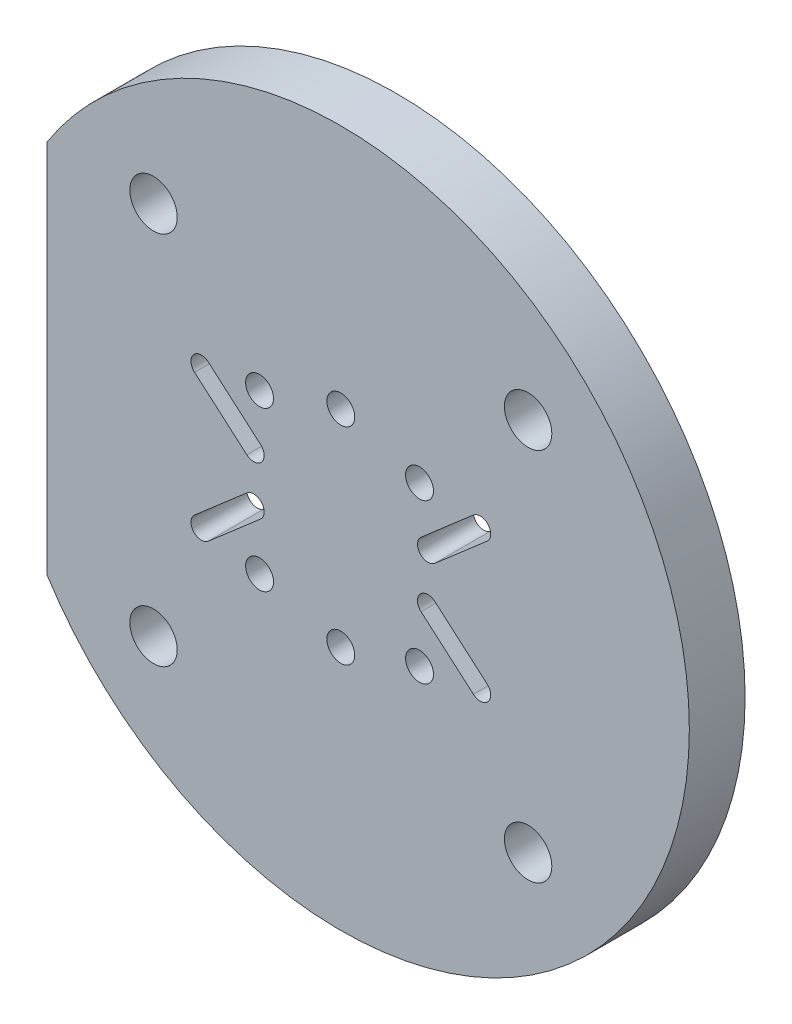
ISO-10303-21;
HEADER;
FILE_DESCRIPTION(('STEP AP214'),'2;1');
FILE_NAME('part.step','',(''),(''),'','','');
FILE_SCHEMA(('AUTOMOTIVE_DESIGN { 1 0 10303 214 1 1 1 1 }'));
ENDSEC;
DATA;
#1=APPLICATION_CONTEXT('core data for automotive mechanical design processes');
#2=APPLICATION_PROTOCOL_DEFINITION('international standard','automotive_design',2000,#1);
#3=PRODUCT_CONTEXT('',#1,'mechanical');
#4=PRODUCT('Part','Part','',(#3));
#5=PRODUCT_RELATED_PRODUCT_CATEGORY('part','',(#4));
#6=PRODUCT_DEFINITION_FORMATION('','',#4);
#7=PRODUCT_DEFINITION_CONTEXT('part definition',#1,'design');
#8=PRODUCT_DEFINITION('design','',#6,#7);
#9=PRODUCT_DEFINITION_SHAPE('','',#8);
#10=(LENGTH_UNIT() NAMED_UNIT(*) SI_UNIT(.MILLI.,.METRE.));
#11=(NAMED_UNIT(*) PLANE_ANGLE_UNIT() SI_UNIT($,.RADIAN.));
#12=(NAMED_UNIT(*) SI_UNIT($,.STERADIAN.) SOLID_ANGLE_UNIT());
#13=UNCERTAINTY_MEASURE_WITH_UNIT(LENGTH_MEASURE(1.E-05),#10,'distance_accuracy_value','');
#14=(GEOMETRIC_REPRESENTATION_CONTEXT(3) GLOBAL_UNCERTAINTY_ASSIGNED_CONTEXT((#13)) GLOBAL_UNIT_ASSIGNED_CONTEXT((#10,
#11,#12)) REPRESENTATION_CONTEXT('',''));
#15=CARTESIAN_POINT('',(0.,0.,0.));
#16=DIRECTION('',(0.,0.,1.));
#17=DIRECTION('',(1.,0.,0.));
#18=AXIS2_PLACEMENT_3D('',#15,#16,#17);
#19=CARTESIAN_POINT('',(0.,0.,4.));
#20=DIRECTION('',(0.,0.,1.));
#21=DIRECTION('',(1.,0.,0.));
#22=AXIS2_PLACEMENT_3D('',#19,#20,#21);
#23=PLANE('',#22);
#24=CARTESIAN_POINT('',(-6.25,1.74999999999999,4.));
#25=DIRECTION('',(0.,0.,1.));
#26=DIRECTION('',(1.,0.,0.));
#27=AXIS2_PLACEMENT_3D('',#24,#25,#26);
#28=CIRCLE('',#27,0.750000000000001);
#29=CARTESIAN_POINT('',(-6.74119790381339,1.18323318790763,4.));
#30=VERTEX_POINT('',#29);
#31=CARTESIAN_POINT('',(-5.75880209618662,2.31676681209235,4.));
#32=VERTEX_POINT('',#31);
#33=EDGE_CURVE('E57',#30,#32,#28,.T.);
#34=ORIENTED_EDGE('',*,*,#33,.F.);
#35=DIRECTION('',(0.755689082789816,-0.654930538417844,0.));
#36=VECTOR('',#35,1.);
#37=CARTESIAN_POINT('',(-6.74119790381339,1.18323318790763,4.));
#38=LINE('',#37,#36);
#39=CARTESIAN_POINT('',(-10.4911979038134,4.43323318790764,4.));
#40=VERTEX_POINT('',#39);
#41=EDGE_CURVE('E227',#40,#30,#38,.T.);
#42=ORIENTED_EDGE('',*,*,#41,.F.);
#43=CARTESIAN_POINT('',(-10.,5.,4.));
#44=DIRECTION('',(0.,0.,1.));
#45=DIRECTION('',(1.,0.,0.));
#46=AXIS2_PLACEMENT_3D('',#43,#44,#45);
#47=CIRCLE('',#46,0.750000000000001);
#48=CARTESIAN_POINT('',(-9.50880209618662,5.56676681209237,4.));
#49=VERTEX_POINT('',#48);
#50=EDGE_CURVE('E247',#49,#40,#47,.T.);
#51=ORIENTED_EDGE('',*,*,#50,.F.);
#52=DIRECTION('',(-0.755689082789816,0.654930538417844,0.));
#53=VECTOR('',#52,1.);
#54=CARTESIAN_POINT('',(-5.75880209618662,2.31676681209235,4.));
#55=LINE('',#54,#53);
#56=EDGE_CURVE('E242',#32,#49,#55,.T.);
#57=ORIENTED_EDGE('',*,*,#56,.F.);
#58=EDGE_LOOP('',(#34,#42,#51,#57));
#59=FACE_BOUND('',#58,.T.);
#60=CARTESIAN_POINT('',(10.,-5.,4.));
#61=DIRECTION('',(0.,0.,1.));
#62=DIRECTION('',(1.,0.,0.));
#63=AXIS2_PLACEMENT_3D('',#60,#61,#62);
#64=CIRCLE('',#63,0.749999999999998);
#65=CARTESIAN_POINT('',(9.50880209618662,-5.56676681209236,4.));
#66=VERTEX_POINT('',#65);
#67=CARTESIAN_POINT('',(10.4911979038134,-4.43323318790764,4.));
#68=VERTEX_POINT('',#67);
#69=EDGE_CURVE('E65',#66,#68,#64,.T.);
#70=ORIENTED_EDGE('',*,*,#69,.F.);
#71=DIRECTION('',(0.755689082789817,-0.654930538417842,0.));
#72=VECTOR('',#71,1.);
#73=CARTESIAN_POINT('',(9.50880209618662,-5.56676681209236,4.));
#74=LINE('',#73,#72);
#75=CARTESIAN_POINT('',(5.75880209618662,-2.31676681209235,4.));
#76=VERTEX_POINT('',#75);
#77=EDGE_CURVE('E271',#76,#66,#74,.T.);
#78=ORIENTED_EDGE('',*,*,#77,.F.);
#79=CARTESIAN_POINT('',(6.25,-1.74999999999999,4.));
#80=DIRECTION('',(0.,0.,1.));
#81=DIRECTION('',(1.,0.,0.));
#82=AXIS2_PLACEMENT_3D('',#79,#80,#81);
#83=CIRCLE('',#82,0.75);
#84=CARTESIAN_POINT('',(6.74119790381338,-1.18323318790763,4.));
#85=VERTEX_POINT('',#84);
#86=EDGE_CURVE('E290',#85,#76,#83,.T.);
#87=ORIENTED_EDGE('',*,*,#86,.F.);
#88=DIRECTION('',(-0.755689082789817,0.654930538417843,0.));
#89=VECTOR('',#88,1.);
#90=CARTESIAN_POINT('',(10.4911979038134,-4.43323318790764,4.));
#91=LINE('',#90,#89);
#92=EDGE_CURVE('E286',#68,#85,#91,.T.);
#93=ORIENTED_EDGE('',*,*,#92,.F.);
#94=EDGE_LOOP('',(#70,#78,#87,#93));
#95=FACE_BOUND('',#94,.T.);
#96=CARTESIAN_POINT('',(10.,5.,4.));
#97=DIRECTION('',(0.,0.,1.));
#98=DIRECTION('',(1.,0.,0.));
#99=AXIS2_PLACEMENT_3D('',#96,#97,#98);
#100=CIRCLE('',#99,0.750000000000002);
#101=CARTESIAN_POINT('',(10.4911979038134,4.43323318790764,4.));
#102=VERTEX_POINT('',#101);
#103=CARTESIAN_POINT('',(9.50880209618662,5.56676681209237,4.));
#104=VERTEX_POINT('',#103);
#105=EDGE_CURVE('E174',#102,#104,#100,.T.);
#106=ORIENTED_EDGE('',*,*,#105,.F.);
#107=DIRECTION('',(0.755689082789817,0.654930538417843,0.));
#108=VECTOR('',#107,1.);
#109=CARTESIAN_POINT('',(10.4911979038134,4.43323318790764,4.));
#110=LINE('',#109,#108);
#111=CARTESIAN_POINT('',(6.74119790381338,1.18323318790763,4.));
#112=VERTEX_POINT('',#111);
#113=EDGE_CURVE('E195',#112,#102,#110,.T.);
#114=ORIENTED_EDGE('',*,*,#113,.F.);
#115=CARTESIAN_POINT('',(6.25,1.75,4.));
#116=DIRECTION('',(0.,0.,1.));
#117=DIRECTION('',(1.,0.,0.));
#118=AXIS2_PLACEMENT_3D('',#115,#116,#117);
#119=CIRCLE('',#118,0.750000000000001);
#120=CARTESIAN_POINT('',(5.75880209618662,2.31676681209236,4.));
#121=VERTEX_POINT('',#120);
#122=EDGE_CURVE('E199',#121,#112,#119,.T.);
#123=ORIENTED_EDGE('',*,*,#122,.F.);
#124=DIRECTION('',(-0.755689082789817,-0.654930538417843,0.));
#125=VECTOR('',#124,1.);
#126=CARTESIAN_POINT('',(9.50880209618662,5.56676681209237,4.));
#127=LINE('',#126,#125);
#128=EDGE_CURVE('E208',#104,#121,#127,.T.);
#129=ORIENTED_EDGE('',*,*,#128,.F.);
#130=EDGE_LOOP('',(#106,#114,#123,#129));
#131=FACE_BOUND('',#130,.T.);
#132=CARTESIAN_POINT('',(-6.25,-1.75,4.));
#133=DIRECTION('',(0.,0.,1.));
#134=DIRECTION('',(1.,0.,0.));
#135=AXIS2_PLACEMENT_3D('',#132,#133,#134);
#136=CIRCLE('',#135,0.750000000000002);
#137=CARTESIAN_POINT('',(-5.75880209618662,-2.31676681209236,4.));
#138=VERTEX_POINT('',#137);
#139=CARTESIAN_POINT('',(-6.74119790381338,-1.18323318790763,4.));
#140=VERTEX_POINT('',#139);
#141=EDGE_CURVE('E257',#138,#140,#136,.T.);
#142=ORIENTED_EDGE('',*,*,#141,.F.);
#143=DIRECTION('',(0.755689082789818,0.654930538417842,0.));
#144=VECTOR('',#143,1.);
#145=CARTESIAN_POINT('',(-5.75880209618662,-2.31676681209236,4.));
#146=LINE('',#145,#144);
#147=CARTESIAN_POINT('',(-9.50880209618662,-5.56676681209236,4.));
#148=VERTEX_POINT('',#147);
#149=EDGE_CURVE('E312',#148,#138,#146,.T.);
#150=ORIENTED_EDGE('',*,*,#149,.F.);
#151=CARTESIAN_POINT('',(-10.,-5.,4.));
#152=DIRECTION('',(0.,0.,1.));
#153=DIRECTION('',(1.,0.,0.));
#154=AXIS2_PLACEMENT_3D('',#151,#152,#153);
#155=CIRCLE('',#154,0.750000000000002);
#156=CARTESIAN_POINT('',(-10.4911979038134,-4.43323318790763,4.));
#157=VERTEX_POINT('',#156);
#158=EDGE_CURVE('E331',#157,#148,#155,.T.);
#159=ORIENTED_EDGE('',*,*,#158,.F.);
#160=DIRECTION('',(-0.755689082789818,-0.654930538417842,0.));
#161=VECTOR('',#160,1.);
#162=CARTESIAN_POINT('',(-6.74119790381338,-1.18323318790763,4.));
#163=LINE('',#162,#161);
#164=EDGE_CURVE('E327',#140,#157,#163,.T.);
#165=ORIENTED_EDGE('',*,*,#164,.F.);
#166=EDGE_LOOP('',(#142,#150,#159,#165));
#167=FACE_BOUND('',#166,.T.);
#168=DIRECTION('',(0.,-1.,0.));
#169=VECTOR('',#168,1.);
#170=CARTESIAN_POINT('',(-21.083168642308,13.4350288425444,4.));
#171=LINE('',#170,#169);
#172=CARTESIAN_POINT('',(-21.083168642308,13.4350288425444,4.));
#173=VERTEX_POINT('',#172);
#174=CARTESIAN_POINT('',(-21.083168642308,-13.4350288425444,4.));
#175=VERTEX_POINT('',#174);
#176=EDGE_CURVE('E351',#173,#175,#171,.T.);
#177=ORIENTED_EDGE('',*,*,#176,.T.);
#178=CARTESIAN_POINT('',(0.,0.,4.));
#179=DIRECTION('',(0.,0.,1.));
#180=DIRECTION('',(1.,0.,0.));
#181=AXIS2_PLACEMENT_3D('',#178,#179,#180);
#182=CIRCLE('',#181,25.);
#183=EDGE_CURVE('E50',#175,#173,#182,.T.);
#184=ORIENTED_EDGE('',*,*,#183,.T.);
#185=EDGE_LOOP('',(#177,#184));
#186=FACE_BOUND('',#185,.T.);
#187=CARTESIAN_POINT('',(-5.82750673468573,5.63428793634296,4.));
#188=DIRECTION('',(0.,0.,-1.));
#189=DIRECTION('',(-1.,0.,0.));
#190=AXIS2_PLACEMENT_3D('',#187,#188,#189);
#191=CIRCLE('',#190,1.);
#192=CARTESIAN_POINT('',(-6.82750673468573,5.63428793634296,4.));
#193=VERTEX_POINT('',#192);
#194=EDGE_CURVE('E369',#193,#193,#191,.T.);
#195=ORIENTED_EDGE('',*,*,#194,.T.);
#196=EDGE_LOOP('',(#195));
#197=FACE_BOUND('',#196,.T.);
#198=CARTESIAN_POINT('',(-5.82750673468573,-5.7586937922313,4.));
#199=DIRECTION('',(0.,0.,-1.));
#200=DIRECTION('',(-1.,0.,0.));
#201=AXIS2_PLACEMENT_3D('',#198,#199,#200);
#202=CIRCLE('',#201,1.);
#203=CARTESIAN_POINT('',(-6.82750673468573,-5.7586937922313,4.));
#204=VERTEX_POINT('',#203);
#205=EDGE_CURVE('E378',#204,#204,#202,.T.);
#206=ORIENTED_EDGE('',*,*,#205,.T.);
#207=EDGE_LOOP('',(#206));
#208=FACE_BOUND('',#207,.T.);
#209=CARTESIAN_POINT('',(0.,-7.39888219603912,4.));
#210=DIRECTION('',(0.,0.,-1.));
#211=DIRECTION('',(-1.,0.,0.));
#212=AXIS2_PLACEMENT_3D('',#209,#210,#211);
#213=CIRCLE('',#212,1.);
#214=CARTESIAN_POINT('',(-1.,-7.39888219603912,4.));
#215=VERTEX_POINT('',#214);
#216=EDGE_CURVE('E386',#215,#215,#213,.T.);
#217=ORIENTED_EDGE('',*,*,#216,.T.);
#218=EDGE_LOOP('',(#217));
#219=FACE_BOUND('',#218,.T.);
#220=CARTESIAN_POINT('',(5.64508041336514,-5.7586937922313,4.));
#221=DIRECTION('',(0.,0.,-1.));
#222=DIRECTION('',(-1.,0.,0.));
#223=AXIS2_PLACEMENT_3D('',#220,#221,#222);
#224=CIRCLE('',#223,1.);
#225=CARTESIAN_POINT('',(4.64508041336514,-5.7586937922313,4.));
#226=VERTEX_POINT('',#225);
#227=EDGE_CURVE('E394',#226,#226,#224,.T.);
#228=ORIENTED_EDGE('',*,*,#227,.T.);
#229=EDGE_LOOP('',(#228));
#230=FACE_BOUND('',#229,.T.);
#231=CARTESIAN_POINT('',(5.64508041336514,5.63428793634296,4.));
#232=DIRECTION('',(0.,0.,-1.));
#233=DIRECTION('',(-1.,0.,0.));
#234=AXIS2_PLACEMENT_3D('',#231,#232,#233);
#235=CIRCLE('',#234,1.);
#236=CARTESIAN_POINT('',(4.64508041336514,5.63428793634296,4.));
#237=VERTEX_POINT('',#236);
#238=EDGE_CURVE('E361',#237,#237,#235,.T.);
#239=ORIENTED_EDGE('',*,*,#238,.T.);
#240=EDGE_LOOP('',(#239));
#241=FACE_BOUND('',#240,.T.);
#242=CARTESIAN_POINT('',(0.,7.39888219603912,4.));
#243=DIRECTION('',(0.,0.,-1.));
#244=DIRECTION('',(-1.,0.,0.));
#245=AXIS2_PLACEMENT_3D('',#242,#243,#244);
#246=CIRCLE('',#245,1.);
#247=CARTESIAN_POINT('',(-1.,7.39888219603912,4.));
#248=VERTEX_POINT('',#247);
#249=EDGE_CURVE('E401',#248,#248,#246,.T.);
#250=ORIENTED_EDGE('',*,*,#249,.T.);
#251=EDGE_LOOP('',(#250));
#252=FACE_BOUND('',#251,.T.);
#253=CARTESIAN_POINT('',(13.4350288425444,-13.4350288425444,4.));
#254=DIRECTION('',(0.,0.,1.));
#255=DIRECTION('',(1.,0.,0.));
#256=AXIS2_PLACEMENT_3D('',#253,#254,#255);
#257=CIRCLE('',#256,1.7);
#258=CARTESIAN_POINT('',(15.1350288425444,-13.4350288425444,4.));
#259=VERTEX_POINT('',#258);
#260=EDGE_CURVE('E417',#259,#259,#257,.T.);
#261=ORIENTED_EDGE('',*,*,#260,.F.);
#262=EDGE_LOOP('',(#261));
#263=FACE_BOUND('',#262,.T.);
#264=CARTESIAN_POINT('',(13.4350288425444,13.4350288425444,4.));
#265=DIRECTION('',(0.,0.,1.));
#266=DIRECTION('',(1.,0.,0.));
#267=AXIS2_PLACEMENT_3D('',#264,#265,#266);
#268=CIRCLE('',#267,1.7);
#269=CARTESIAN_POINT('',(15.1350288425444,13.4350288425444,4.));
#270=VERTEX_POINT('',#269);
#271=EDGE_CURVE('E433',#270,#270,#268,.T.);
#272=ORIENTED_EDGE('',*,*,#271,.F.);
#273=EDGE_LOOP('',(#272));
#274=FACE_BOUND('',#273,.T.);
#275=CARTESIAN_POINT('',(-13.4350288425444,13.4350288425444,4.));
#276=DIRECTION('',(0.,0.,1.));
#277=DIRECTION('',(1.,0.,0.));
#278=AXIS2_PLACEMENT_3D('',#275,#276,#277);
#279=CIRCLE('',#278,1.7);
#280=CARTESIAN_POINT('',(-11.7350288425444,13.4350288425444,4.));
#281=VERTEX_POINT('',#280);
#282=EDGE_CURVE('E425',#281,#281,#279,.T.);
#283=ORIENTED_EDGE('',*,*,#282,.F.);
#284=EDGE_LOOP('',(#283));
#285=FACE_BOUND('',#284,.T.);
#286=CARTESIAN_POINT('',(-13.4350288425444,-13.4350288425444,4.));
#287=DIRECTION('',(0.,0.,1.));
#288=DIRECTION('',(1.,0.,0.));
#289=AXIS2_PLACEMENT_3D('',#286,#287,#288);
#290=CIRCLE('',#289,1.7);
#291=CARTESIAN_POINT('',(-11.7350288425444,-13.4350288425444,4.));
#292=VERTEX_POINT('',#291);
#293=EDGE_CURVE('E409',#292,#292,#290,.T.);
#294=ORIENTED_EDGE('',*,*,#293,.F.);
#295=EDGE_LOOP('',(#294));
#296=FACE_BOUND('',#295,.T.);
#297=ADVANCED_FACE('F41',(#59,#95,#131,#167,#186,#197,#208,#219,#230,#241,#252,#263,#274,#285,
#296),#23,.T.);
#298=CARTESIAN_POINT('',(0.,0.,0.));
#299=DIRECTION('',(0.,0.,1.));
#300=DIRECTION('',(1.,0.,0.));
#301=AXIS2_PLACEMENT_3D('',#298,#299,#300);
#302=PLANE('',#301);
#303=DIRECTION('',(0.755689082789816,-0.654930538417844,0.));
#304=VECTOR('',#303,1.);
#305=CARTESIAN_POINT('',(-6.74119790381339,1.18323318790763,0.));
#306=LINE('',#305,#304);
#307=CARTESIAN_POINT('',(-10.4911979038134,4.43323318790764,0.));
#308=VERTEX_POINT('',#307);
#309=CARTESIAN_POINT('',(-6.74119790381339,1.18323318790763,0.));
#310=VERTEX_POINT('',#309);
#311=EDGE_CURVE('E235',#308,#310,#306,.T.);
#312=ORIENTED_EDGE('',*,*,#311,.T.);
#313=CARTESIAN_POINT('',(-6.25,1.74999999999999,0.));
#314=DIRECTION('',(0.,0.,1.));
#315=DIRECTION('',(1.,0.,0.));
#316=AXIS2_PLACEMENT_3D('',#313,#314,#315);
#317=CIRCLE('',#316,0.750000000000001);
#318=CARTESIAN_POINT('',(-5.75880209618662,2.31676681209235,0.));
#319=VERTEX_POINT('',#318);
#320=EDGE_CURVE('E222',#310,#319,#317,.T.);
#321=ORIENTED_EDGE('',*,*,#320,.T.);
#322=DIRECTION('',(-0.755689082789816,0.654930538417844,0.));
#323=VECTOR('',#322,1.);
#324=CARTESIAN_POINT('',(-5.75880209618662,2.31676681209235,0.));
#325=LINE('',#324,#323);
#326=CARTESIAN_POINT('',(-9.50880209618662,5.56676681209237,0.));
#327=VERTEX_POINT('',#326);
#328=EDGE_CURVE('E226',#319,#327,#325,.T.);
#329=ORIENTED_EDGE('',*,*,#328,.T.);
#330=CARTESIAN_POINT('',(-10.,5.,0.));
#331=DIRECTION('',(0.,0.,1.));
#332=DIRECTION('',(1.,0.,0.));
#333=AXIS2_PLACEMENT_3D('',#330,#331,#332);
#334=CIRCLE('',#333,0.750000000000001);
#335=EDGE_CURVE('E231',#327,#308,#334,.T.);
#336=ORIENTED_EDGE('',*,*,#335,.T.);
#337=EDGE_LOOP('',(#312,#321,#329,#336));
#338=FACE_BOUND('',#337,.T.);
#339=DIRECTION('',(0.755689082789817,-0.654930538417842,0.));
#340=VECTOR('',#339,1.);
#341=CARTESIAN_POINT('',(9.50880209618662,-5.56676681209236,0.));
#342=LINE('',#341,#340);
#343=CARTESIAN_POINT('',(5.75880209618662,-2.31676681209235,0.));
#344=VERTEX_POINT('',#343);
#345=CARTESIAN_POINT('',(9.50880209618662,-5.56676681209236,0.));
#346=VERTEX_POINT('',#345);
#347=EDGE_CURVE('E279',#344,#346,#342,.T.);
#348=ORIENTED_EDGE('',*,*,#347,.T.);
#349=CARTESIAN_POINT('',(10.,-5.,0.));
#350=DIRECTION('',(0.,0.,1.));
#351=DIRECTION('',(1.,0.,0.));
#352=AXIS2_PLACEMENT_3D('',#349,#350,#351);
#353=CIRCLE('',#352,0.749999999999998);
#354=CARTESIAN_POINT('',(10.4911979038134,-4.43323318790764,0.));
#355=VERTEX_POINT('',#354);
#356=EDGE_CURVE('E266',#346,#355,#353,.T.);
#357=ORIENTED_EDGE('',*,*,#356,.T.);
#358=DIRECTION('',(-0.755689082789817,0.654930538417843,0.));
#359=VECTOR('',#358,1.);
#360=CARTESIAN_POINT('',(10.4911979038134,-4.43323318790764,0.));
#361=LINE('',#360,#359);
#362=CARTESIAN_POINT('',(6.74119790381339,-1.18323318790763,0.));
#363=VERTEX_POINT('',#362);
#364=EDGE_CURVE('E270',#355,#363,#361,.T.);
#365=ORIENTED_EDGE('',*,*,#364,.T.);
#366=CARTESIAN_POINT('',(6.25,-1.74999999999999,0.));
#367=DIRECTION('',(0.,0.,1.));
#368=DIRECTION('',(1.,0.,0.));
#369=AXIS2_PLACEMENT_3D('',#366,#367,#368);
#370=CIRCLE('',#369,0.75);
#371=EDGE_CURVE('E275',#363,#344,#370,.T.);
#372=ORIENTED_EDGE('',*,*,#371,.T.);
#373=EDGE_LOOP('',(#348,#357,#365,#372));
#374=FACE_BOUND('',#373,.T.);
#375=DIRECTION('',(0.755689082789817,0.654930538417843,0.));
#376=VECTOR('',#375,1.);
#377=CARTESIAN_POINT('',(10.4911979038134,4.43323318790764,0.));
#378=LINE('',#377,#376);
#379=CARTESIAN_POINT('',(6.74119790381338,1.18323318790763,0.));
#380=VERTEX_POINT('',#379);
#381=CARTESIAN_POINT('',(10.4911979038134,4.43323318790764,0.));
#382=VERTEX_POINT('',#381);
#383=EDGE_CURVE('E180',#380,#382,#378,.T.);
#384=ORIENTED_EDGE('',*,*,#383,.T.);
#385=CARTESIAN_POINT('',(10.,5.,0.));
#386=DIRECTION('',(0.,0.,1.));
#387=DIRECTION('',(1.,0.,0.));
#388=AXIS2_PLACEMENT_3D('',#385,#386,#387);
#389=CIRCLE('',#388,0.750000000000002);
#390=CARTESIAN_POINT('',(9.50880209618662,5.56676681209237,0.));
#391=VERTEX_POINT('',#390);
#392=EDGE_CURVE('E171',#382,#391,#389,.T.);
#393=ORIENTED_EDGE('',*,*,#392,.T.);
#394=DIRECTION('',(-0.755689082789817,-0.654930538417843,0.));
#395=VECTOR('',#394,1.);
#396=CARTESIAN_POINT('',(9.50880209618662,5.56676681209237,0.));
#397=LINE('',#396,#395);
#398=CARTESIAN_POINT('',(5.75880209618662,2.31676681209236,0.));
#399=VERTEX_POINT('',#398);
#400=EDGE_CURVE('E184',#391,#399,#397,.T.);
#401=ORIENTED_EDGE('',*,*,#400,.T.);
#402=CARTESIAN_POINT('',(6.25,1.75,0.));
#403=DIRECTION('',(0.,0.,1.));
#404=DIRECTION('',(1.,0.,0.));
#405=AXIS2_PLACEMENT_3D('',#402,#403,#404);
#406=CIRCLE('',#405,0.750000000000001);
#407=EDGE_CURVE('E189',#399,#380,#406,.T.);
#408=ORIENTED_EDGE('',*,*,#407,.T.);
#409=EDGE_LOOP('',(#384,#393,#401,#408));
#410=FACE_BOUND('',#409,.T.);
#411=DIRECTION('',(0.755689082789818,0.654930538417842,0.));
#412=VECTOR('',#411,1.);
#413=CARTESIAN_POINT('',(-5.75880209618662,-2.31676681209236,0.));
#414=LINE('',#413,#412);
#415=CARTESIAN_POINT('',(-9.50880209618662,-5.56676681209236,0.));
#416=VERTEX_POINT('',#415);
#417=CARTESIAN_POINT('',(-5.75880209618662,-2.31676681209236,0.));
#418=VERTEX_POINT('',#417);
#419=EDGE_CURVE('E320',#416,#418,#414,.T.);
#420=ORIENTED_EDGE('',*,*,#419,.T.);
#421=CARTESIAN_POINT('',(-6.25,-1.75,0.));
#422=DIRECTION('',(0.,0.,1.));
#423=DIRECTION('',(1.,0.,0.));
#424=AXIS2_PLACEMENT_3D('',#421,#422,#423);
#425=CIRCLE('',#424,0.750000000000002);
#426=CARTESIAN_POINT('',(-6.74119790381338,-1.18323318790763,0.));
#427=VERTEX_POINT('',#426);
#428=EDGE_CURVE('E307',#418,#427,#425,.T.);
#429=ORIENTED_EDGE('',*,*,#428,.T.);
#430=DIRECTION('',(-0.755689082789818,-0.654930538417842,0.));
#431=VECTOR('',#430,1.);
#432=CARTESIAN_POINT('',(-6.74119790381338,-1.18323318790763,0.));
#433=LINE('',#432,#431);
#434=CARTESIAN_POINT('',(-10.4911979038134,-4.43323318790763,0.));
#435=VERTEX_POINT('',#434);
#436=EDGE_CURVE('E311',#427,#435,#433,.T.);
#437=ORIENTED_EDGE('',*,*,#436,.T.);
#438=CARTESIAN_POINT('',(-10.,-5.,0.));
#439=DIRECTION('',(0.,0.,1.));
#440=DIRECTION('',(1.,0.,0.));
#441=AXIS2_PLACEMENT_3D('',#438,#439,#440);
#442=CIRCLE('',#441,0.750000000000002);
#443=EDGE_CURVE('E316',#435,#416,#442,.T.);
#444=ORIENTED_EDGE('',*,*,#443,.T.);
#445=EDGE_LOOP('',(#420,#429,#437,#444));
#446=FACE_BOUND('',#445,.T.);
#447=CARTESIAN_POINT('',(-5.82750673468573,5.63428793634296,0.));
#448=DIRECTION('',(0.,0.,-1.));
#449=DIRECTION('',(-1.,0.,0.));
#450=AXIS2_PLACEMENT_3D('',#447,#448,#449);
#451=CIRCLE('',#450,1.);
#452=CARTESIAN_POINT('',(-6.82750673468573,5.63428793634296,0.));
#453=VERTEX_POINT('',#452);
#454=EDGE_CURVE('E374',#453,#453,#451,.T.);
#455=ORIENTED_EDGE('',*,*,#454,.F.);
#456=EDGE_LOOP('',(#455));
#457=FACE_BOUND('',#456,.T.);
#458=CARTESIAN_POINT('',(-5.82750673468573,-5.7586937922313,0.));
#459=DIRECTION('',(0.,0.,-1.));
#460=DIRECTION('',(-1.,0.,0.));
#461=AXIS2_PLACEMENT_3D('',#458,#459,#460);
#462=CIRCLE('',#461,1.);
#463=CARTESIAN_POINT('',(-6.82750673468573,-5.7586937922313,0.));
#464=VERTEX_POINT('',#463);
#465=EDGE_CURVE('E382',#464,#464,#462,.T.);
#466=ORIENTED_EDGE('',*,*,#465,.F.);
#467=EDGE_LOOP('',(#466));
#468=FACE_BOUND('',#467,.T.);
#469=CARTESIAN_POINT('',(0.,-7.39888219603912,0.));
#470=DIRECTION('',(0.,0.,-1.));
#471=DIRECTION('',(-1.,0.,0.));
#472=AXIS2_PLACEMENT_3D('',#469,#470,#471);
#473=CIRCLE('',#472,1.);
#474=CARTESIAN_POINT('',(-1.,-7.39888219603912,0.));
#475=VERTEX_POINT('',#474);
#476=EDGE_CURVE('E390',#475,#475,#473,.T.);
#477=ORIENTED_EDGE('',*,*,#476,.F.);
#478=EDGE_LOOP('',(#477));
#479=FACE_BOUND('',#478,.T.);
#480=CARTESIAN_POINT('',(5.64508041336514,-5.7586937922313,0.));
#481=DIRECTION('',(0.,0.,-1.));
#482=DIRECTION('',(-1.,0.,0.));
#483=AXIS2_PLACEMENT_3D('',#480,#481,#482);
#484=CIRCLE('',#483,1.);
#485=CARTESIAN_POINT('',(4.64508041336514,-5.7586937922313,0.));
#486=VERTEX_POINT('',#485);
#487=EDGE_CURVE('E365',#486,#486,#484,.T.);
#488=ORIENTED_EDGE('',*,*,#487,.F.);
#489=EDGE_LOOP('',(#488));
#490=FACE_BOUND('',#489,.T.);
#491=CARTESIAN_POINT('',(5.64508041336514,5.63428793634296,0.));
#492=DIRECTION('',(0.,0.,-1.));
#493=DIRECTION('',(-1.,0.,0.));
#494=AXIS2_PLACEMENT_3D('',#491,#492,#493);
#495=CIRCLE('',#494,1.);
#496=CARTESIAN_POINT('',(4.64508041336514,5.63428793634296,0.));
#497=VERTEX_POINT('',#496);
#498=EDGE_CURVE('E360',#497,#497,#495,.T.);
#499=ORIENTED_EDGE('',*,*,#498,.F.);
#500=EDGE_LOOP('',(#499));
#501=FACE_BOUND('',#500,.T.);
#502=CARTESIAN_POINT('',(0.,7.39888219603912,0.));
#503=DIRECTION('',(0.,0.,-1.));
#504=DIRECTION('',(-1.,0.,0.));
#505=AXIS2_PLACEMENT_3D('',#502,#503,#504);
#506=CIRCLE('',#505,1.);
#507=CARTESIAN_POINT('',(-1.,7.39888219603912,0.));
#508=VERTEX_POINT('',#507);
#509=EDGE_CURVE('E373',#508,#508,#506,.T.);
#510=ORIENTED_EDGE('',*,*,#509,.F.);
#511=EDGE_LOOP('',(#510));
#512=FACE_BOUND('',#511,.T.);
#513=CARTESIAN_POINT('',(0.,0.,0.));
#514=DIRECTION('',(0.,0.,1.));
#515=DIRECTION('',(1.,0.,0.));
#516=AXIS2_PLACEMENT_3D('',#513,#514,#515);
#517=CIRCLE('',#516,25.);
#518=CARTESIAN_POINT('',(-21.083168642308,-13.4350288425444,0.));
#519=VERTEX_POINT('',#518);
#520=CARTESIAN_POINT('',(-21.083168642308,13.4350288425444,0.));
#521=VERTEX_POINT('',#520);
#522=EDGE_CURVE('E437',#519,#521,#517,.T.);
#523=ORIENTED_EDGE('',*,*,#522,.F.);
#524=DIRECTION('',(0.,-1.,0.));
#525=VECTOR('',#524,1.);
#526=CARTESIAN_POINT('',(-21.083168642308,13.4350288425444,0.));
#527=LINE('',#526,#525);
#528=EDGE_CURVE('E341',#521,#519,#527,.T.);
#529=ORIENTED_EDGE('',*,*,#528,.F.);
#530=EDGE_LOOP('',(#523,#529));
#531=FACE_BOUND('',#530,.T.);
#532=CARTESIAN_POINT('',(13.4350288425444,13.4350288425444,0.));
#533=DIRECTION('',(0.,0.,1.));
#534=DIRECTION('',(1.,0.,0.));
#535=AXIS2_PLACEMENT_3D('',#532,#533,#534);
#536=CIRCLE('',#535,1.7);
#537=CARTESIAN_POINT('',(15.1350288425444,13.4350288425444,0.));
#538=VERTEX_POINT('',#537);
#539=EDGE_CURVE('E429',#538,#538,#536,.T.);
#540=ORIENTED_EDGE('',*,*,#539,.T.);
#541=EDGE_LOOP('',(#540));
#542=FACE_BOUND('',#541,.T.);
#543=CARTESIAN_POINT('',(-13.4350288425444,13.4350288425444,0.));
#544=DIRECTION('',(0.,0.,1.));
#545=DIRECTION('',(1.,0.,0.));
#546=AXIS2_PLACEMENT_3D('',#543,#544,#545);
#547=CIRCLE('',#546,1.7);
#548=CARTESIAN_POINT('',(-11.7350288425444,13.4350288425444,0.));
#549=VERTEX_POINT('',#548);
#550=EDGE_CURVE('E421',#549,#549,#547,.T.);
#551=ORIENTED_EDGE('',*,*,#550,.T.);
#552=EDGE_LOOP('',(#551));
#553=FACE_BOUND('',#552,.T.);
#554=CARTESIAN_POINT('',(13.4350288425444,-13.4350288425444,0.));
#555=DIRECTION('',(0.,0.,1.));
#556=DIRECTION('',(1.,0.,0.));
#557=AXIS2_PLACEMENT_3D('',#554,#555,#556);
#558=CIRCLE('',#557,1.7);
#559=CARTESIAN_POINT('',(15.1350288425444,-13.4350288425444,0.));
#560=VERTEX_POINT('',#559);
#561=EDGE_CURVE('E413',#560,#560,#558,.T.);
#562=ORIENTED_EDGE('',*,*,#561,.T.);
#563=EDGE_LOOP('',(#562));
#564=FACE_BOUND('',#563,.T.);
#565=CARTESIAN_POINT('',(-13.4350288425444,-13.4350288425444,0.));
#566=DIRECTION('',(0.,0.,1.));
#567=DIRECTION('',(1.,0.,0.));
#568=AXIS2_PLACEMENT_3D('',#565,#566,#567);
#569=CIRCLE('',#568,1.7);
#570=CARTESIAN_POINT('',(-11.7350288425444,-13.4350288425444,0.));
#571=VERTEX_POINT('',#570);
#572=EDGE_CURVE('E405',#571,#571,#569,.T.);
#573=ORIENTED_EDGE('',*,*,#572,.T.);
#574=EDGE_LOOP('',(#573));
#575=FACE_BOUND('',#574,.T.);
#576=ADVANCED_FACE('F191',(#338,#374,#410,#446,#457,#468,#479,#490,#501,#512,#531,#542,#553,
#564,#575),#302,.F.);
#577=CARTESIAN_POINT('',(0.,0.,4.));
#578=DIRECTION('',(0.,0.,-1.));
#579=DIRECTION('',(-1.,0.,0.));
#580=AXIS2_PLACEMENT_3D('',#577,#578,#579);
#581=CYLINDRICAL_SURFACE('',#580,25.);
#582=ORIENTED_EDGE('',*,*,#183,.F.);
#583=DIRECTION('',(0.,0.,-1.));
#584=VECTOR('',#583,1.);
#585=CARTESIAN_POINT('',(-21.083168642308,-13.4350288425444,4.));
#586=LINE('',#585,#584);
#587=EDGE_CURVE('E11',#175,#519,#586,.T.);
#588=ORIENTED_EDGE('',*,*,#587,.T.);
#589=ORIENTED_EDGE('',*,*,#522,.T.);
#590=DIRECTION('',(0.,0.,-1.));
#591=VECTOR('',#590,1.);
#592=CARTESIAN_POINT('',(-21.083168642308,13.4350288425444,4.));
#593=LINE('',#592,#591);
#594=EDGE_CURVE('E355',#173,#521,#593,.T.);
#595=ORIENTED_EDGE('',*,*,#594,.F.);
#596=EDGE_LOOP('',(#582,#588,#589,#595));
#597=FACE_BOUND('',#596,.T.);
#598=ADVANCED_FACE('F43',(#597),#581,.T.);
#599=CARTESIAN_POINT('',(13.4350288425444,13.4350288425444,4.));
#600=DIRECTION('',(0.,0.,-1.));
#601=DIRECTION('',(-1.,0.,0.));
#602=AXIS2_PLACEMENT_3D('',#599,#600,#601);
#603=CYLINDRICAL_SURFACE('',#602,1.7);
#604=ORIENTED_EDGE('',*,*,#271,.T.);
#605=EDGE_LOOP('',(#604));
#606=FACE_BOUND('',#605,.T.);
#607=ORIENTED_EDGE('',*,*,#539,.F.);
#608=EDGE_LOOP('',(#607));
#609=FACE_BOUND('',#608,.T.);
#610=ADVANCED_FACE('F492',(#606,#609),#603,.F.);
#611=CARTESIAN_POINT('',(-13.4350288425444,13.4350288425444,4.));
#612=DIRECTION('',(0.,0.,-1.));
#613=DIRECTION('',(-1.,0.,0.));
#614=AXIS2_PLACEMENT_3D('',#611,#612,#613);
#615=CYLINDRICAL_SURFACE('',#614,1.7);
#616=ORIENTED_EDGE('',*,*,#282,.T.);
#617=EDGE_LOOP('',(#616));
#618=FACE_BOUND('',#617,.T.);
#619=ORIENTED_EDGE('',*,*,#550,.F.);
#620=EDGE_LOOP('',(#619));
#621=FACE_BOUND('',#620,.T.);
#622=ADVANCED_FACE('F497',(#618,#621),#615,.F.);
#623=CARTESIAN_POINT('',(13.4350288425444,-13.4350288425444,4.));
#624=DIRECTION('',(0.,0.,-1.));
#625=DIRECTION('',(-1.,0.,0.));
#626=AXIS2_PLACEMENT_3D('',#623,#624,#625);
#627=CYLINDRICAL_SURFACE('',#626,1.7);
#628=ORIENTED_EDGE('',*,*,#260,.T.);
#629=EDGE_LOOP('',(#628));
#630=FACE_BOUND('',#629,.T.);
#631=ORIENTED_EDGE('',*,*,#561,.F.);
#632=EDGE_LOOP('',(#631));
#633=FACE_BOUND('',#632,.T.);
#634=ADVANCED_FACE('F483',(#630,#633),#627,.F.);
#635=CARTESIAN_POINT('',(-13.4350288425444,-13.4350288425444,4.));
#636=DIRECTION('',(0.,0.,-1.));
#637=DIRECTION('',(-1.,0.,0.));
#638=AXIS2_PLACEMENT_3D('',#635,#636,#637);
#639=CYLINDRICAL_SURFACE('',#638,1.7);
#640=ORIENTED_EDGE('',*,*,#293,.T.);
#641=EDGE_LOOP('',(#640));
#642=FACE_BOUND('',#641,.T.);
#643=ORIENTED_EDGE('',*,*,#572,.F.);
#644=EDGE_LOOP('',(#643));
#645=FACE_BOUND('',#644,.T.);
#646=ADVANCED_FACE('F479',(#642,#645),#639,.F.);
#647=CARTESIAN_POINT('',(0.,7.39888219603912,4.));
#648=DIRECTION('',(0.,0.,-1.));
#649=DIRECTION('',(-1.,0.,0.));
#650=AXIS2_PLACEMENT_3D('',#647,#648,#649);
#651=CYLINDRICAL_SURFACE('',#650,1.);
#652=ORIENTED_EDGE('',*,*,#249,.F.);
#653=EDGE_LOOP('',(#652));
#654=FACE_BOUND('',#653,.T.);
#655=ORIENTED_EDGE('',*,*,#509,.T.);
#656=EDGE_LOOP('',(#655));
#657=FACE_BOUND('',#656,.T.);
#658=ADVANCED_FACE('F482',(#654,#657),#651,.F.);
#659=CARTESIAN_POINT('',(5.64508041336514,5.63428793634296,4.));
#660=DIRECTION('',(0.,0.,-1.));
#661=DIRECTION('',(-1.,0.,0.));
#662=AXIS2_PLACEMENT_3D('',#659,#660,#661);
#663=CYLINDRICAL_SURFACE('',#662,1.);
#664=ORIENTED_EDGE('',*,*,#238,.F.);
#665=EDGE_LOOP('',(#664));
#666=FACE_BOUND('',#665,.T.);
#667=ORIENTED_EDGE('',*,*,#498,.T.);
#668=EDGE_LOOP('',(#667));
#669=FACE_BOUND('',#668,.T.);
#670=ADVANCED_FACE('F507',(#666,#669),#663,.F.);
#671=CARTESIAN_POINT('',(5.64508041336514,-5.7586937922313,4.));
#672=DIRECTION('',(0.,0.,-1.));
#673=DIRECTION('',(-1.,0.,0.));
#674=AXIS2_PLACEMENT_3D('',#671,#672,#673);
#675=CYLINDRICAL_SURFACE('',#674,1.);
#676=ORIENTED_EDGE('',*,*,#227,.F.);
#677=EDGE_LOOP('',(#676));
#678=FACE_BOUND('',#677,.T.);
#679=ORIENTED_EDGE('',*,*,#487,.T.);
#680=EDGE_LOOP('',(#679));
#681=FACE_BOUND('',#680,.T.);
#682=ADVANCED_FACE('F509',(#678,#681),#675,.F.);
#683=CARTESIAN_POINT('',(0.,-7.39888219603912,4.));
#684=DIRECTION('',(0.,0.,-1.));
#685=DIRECTION('',(-1.,0.,0.));
#686=AXIS2_PLACEMENT_3D('',#683,#684,#685);
#687=CYLINDRICAL_SURFACE('',#686,1.);
#688=ORIENTED_EDGE('',*,*,#216,.F.);
#689=EDGE_LOOP('',(#688));
#690=FACE_BOUND('',#689,.T.);
#691=ORIENTED_EDGE('',*,*,#476,.T.);
#692=EDGE_LOOP('',(#691));
#693=FACE_BOUND('',#692,.T.);
#694=ADVANCED_FACE('F512',(#690,#693),#687,.F.);
#695=CARTESIAN_POINT('',(-5.82750673468573,-5.7586937922313,4.));
#696=DIRECTION('',(0.,0.,-1.));
#697=DIRECTION('',(-1.,0.,0.));
#698=AXIS2_PLACEMENT_3D('',#695,#696,#697);
#699=CYLINDRICAL_SURFACE('',#698,1.);
#700=ORIENTED_EDGE('',*,*,#205,.F.);
#701=EDGE_LOOP('',(#700));
#702=FACE_BOUND('',#701,.T.);
#703=ORIENTED_EDGE('',*,*,#465,.T.);
#704=EDGE_LOOP('',(#703));
#705=FACE_BOUND('',#704,.T.);
#706=ADVANCED_FACE('F516',(#702,#705),#699,.F.);
#707=CARTESIAN_POINT('',(-5.82750673468573,5.63428793634296,4.));
#708=DIRECTION('',(0.,0.,-1.));
#709=DIRECTION('',(-1.,0.,0.));
#710=AXIS2_PLACEMENT_3D('',#707,#708,#709);
#711=CYLINDRICAL_SURFACE('',#710,1.);
#712=ORIENTED_EDGE('',*,*,#194,.F.);
#713=EDGE_LOOP('',(#712));
#714=FACE_BOUND('',#713,.T.);
#715=ORIENTED_EDGE('',*,*,#454,.T.);
#716=EDGE_LOOP('',(#715));
#717=FACE_BOUND('',#716,.T.);
#718=ADVANCED_FACE('F520',(#714,#717),#711,.F.);
#719=CARTESIAN_POINT('',(-21.083168642308,13.4350288425444,4.));
#720=DIRECTION('',(1.,0.,0.));
#721=DIRECTION('',(0.,0.,-1.));
#722=AXIS2_PLACEMENT_3D('',#719,#720,#721);
#723=PLANE('',#722);
#724=ORIENTED_EDGE('',*,*,#176,.F.);
#725=ORIENTED_EDGE('',*,*,#594,.T.);
#726=ORIENTED_EDGE('',*,*,#528,.T.);
#727=ORIENTED_EDGE('',*,*,#587,.F.);
#728=EDGE_LOOP('',(#724,#725,#726,#727));
#729=FACE_BOUND('',#728,.T.);
#730=ADVANCED_FACE('F453',(#729),#723,.F.);
#731=CARTESIAN_POINT('',(-6.25,-1.75,0.));
#732=DIRECTION('',(0.,0.,1.));
#733=DIRECTION('',(1.,0.,0.));
#734=AXIS2_PLACEMENT_3D('',#731,#732,#733);
#735=CYLINDRICAL_SURFACE('',#734,0.750000000000002);
#736=ORIENTED_EDGE('',*,*,#141,.T.);
#737=DIRECTION('',(0.,0.,1.));
#738=VECTOR('',#737,1.);
#739=CARTESIAN_POINT('',(-6.74119790381338,-1.18323318790763,0.));
#740=LINE('',#739,#738);
#741=EDGE_CURVE('E324',#427,#140,#740,.T.);
#742=ORIENTED_EDGE('',*,*,#741,.F.);
#743=ORIENTED_EDGE('',*,*,#428,.F.);
#744=DIRECTION('',(0.,0.,1.));
#745=VECTOR('',#744,1.);
#746=CARTESIAN_POINT('',(-5.75880209618662,-2.31676681209236,0.));
#747=LINE('',#746,#745);
#748=EDGE_CURVE('E338',#418,#138,#747,.T.);
#749=ORIENTED_EDGE('',*,*,#748,.T.);
#750=EDGE_LOOP('',(#736,#742,#743,#749));
#751=FACE_BOUND('',#750,.T.);
#752=ADVANCED_FACE('F530',(#751),#735,.F.);
#753=CARTESIAN_POINT('',(-5.75880209618662,-2.31676681209236,0.));
#754=DIRECTION('',(0.654930538417841,-0.755689082789818,0.));
#755=DIRECTION('',(0.755689082789818,0.654930538417842,0.));
#756=AXIS2_PLACEMENT_3D('',#753,#754,#755);
#757=PLANE('',#756);
#758=ORIENTED_EDGE('',*,*,#149,.T.);
#759=ORIENTED_EDGE('',*,*,#748,.F.);
#760=ORIENTED_EDGE('',*,*,#419,.F.);
#761=DIRECTION('',(0.,0.,1.));
#762=VECTOR('',#761,1.);
#763=CARTESIAN_POINT('',(-9.50880209618662,-5.56676681209236,0.));
#764=LINE('',#763,#762);
#765=EDGE_CURVE('E342',#416,#148,#764,.T.);
#766=ORIENTED_EDGE('',*,*,#765,.T.);
#767=EDGE_LOOP('',(#758,#759,#760,#766));
#768=FACE_BOUND('',#767,.T.);
#769=ADVANCED_FACE('F533',(#768),#757,.F.);
#770=CARTESIAN_POINT('',(-10.,-5.,0.));
#771=DIRECTION('',(0.,0.,1.));
#772=DIRECTION('',(1.,0.,0.));
#773=AXIS2_PLACEMENT_3D('',#770,#771,#772);
#774=CYLINDRICAL_SURFACE('',#773,0.750000000000002);
#775=ORIENTED_EDGE('',*,*,#158,.T.);
#776=ORIENTED_EDGE('',*,*,#765,.F.);
#777=ORIENTED_EDGE('',*,*,#443,.F.);
#778=DIRECTION('',(0.,0.,1.));
#779=VECTOR('',#778,1.);
#780=CARTESIAN_POINT('',(-10.4911979038134,-4.43323318790763,0.));
#781=LINE('',#780,#779);
#782=EDGE_CURVE('E345',#435,#157,#781,.T.);
#783=ORIENTED_EDGE('',*,*,#782,.T.);
#784=EDGE_LOOP('',(#775,#776,#777,#783));
#785=FACE_BOUND('',#784,.T.);
#786=ADVANCED_FACE('F538',(#785),#774,.F.);
#787=CARTESIAN_POINT('',(-6.74119790381338,-1.18323318790763,0.));
#788=DIRECTION('',(-0.654930538417841,0.755689082789818,0.));
#789=DIRECTION('',(-0.755689082789818,-0.654930538417842,0.));
#790=AXIS2_PLACEMENT_3D('',#787,#788,#789);
#791=PLANE('',#790);
#792=ORIENTED_EDGE('',*,*,#164,.T.);
#793=ORIENTED_EDGE('',*,*,#782,.F.);
#794=ORIENTED_EDGE('',*,*,#436,.F.);
#795=ORIENTED_EDGE('',*,*,#741,.T.);
#796=EDGE_LOOP('',(#792,#793,#794,#795));
#797=FACE_BOUND('',#796,.T.);
#798=ADVANCED_FACE('F535',(#797),#791,.F.);
#799=CARTESIAN_POINT('',(10.,5.,0.));
#800=DIRECTION('',(0.,0.,1.));
#801=DIRECTION('',(1.,0.,0.));
#802=AXIS2_PLACEMENT_3D('',#799,#800,#801);
#803=CYLINDRICAL_SURFACE('',#802,0.750000000000002);
#804=ORIENTED_EDGE('',*,*,#105,.T.);
#805=DIRECTION('',(0.,0.,1.));
#806=VECTOR('',#805,1.);
#807=CARTESIAN_POINT('',(9.50880209618662,5.56676681209237,0.));
#808=LINE('',#807,#806);
#809=EDGE_CURVE('E167',#391,#104,#808,.T.);
#810=ORIENTED_EDGE('',*,*,#809,.F.);
#811=ORIENTED_EDGE('',*,*,#392,.F.);
#812=DIRECTION('',(0.,0.,1.));
#813=VECTOR('',#812,1.);
#814=CARTESIAN_POINT('',(10.4911979038134,4.43323318790764,0.));
#815=LINE('',#814,#813);
#816=EDGE_CURVE('E214',#382,#102,#815,.T.);
#817=ORIENTED_EDGE('',*,*,#816,.T.);
#818=EDGE_LOOP('',(#804,#810,#811,#817));
#819=FACE_BOUND('',#818,.T.);
#820=ADVANCED_FACE('F169',(#819),#803,.F.);
#821=CARTESIAN_POINT('',(10.4911979038134,4.43323318790764,0.));
#822=DIRECTION('',(0.654930538417843,-0.755689082789817,0.));
#823=DIRECTION('',(0.755689082789817,0.654930538417843,0.));
#824=AXIS2_PLACEMENT_3D('',#821,#822,#823);
#825=PLANE('',#824);
#826=ORIENTED_EDGE('',*,*,#113,.T.);
#827=ORIENTED_EDGE('',*,*,#816,.F.);
#828=ORIENTED_EDGE('',*,*,#383,.F.);
#829=DIRECTION('',(0.,0.,1.));
#830=VECTOR('',#829,1.);
#831=CARTESIAN_POINT('',(6.74119790381338,1.18323318790763,0.));
#832=LINE('',#831,#830);
#833=EDGE_CURVE('E217',#380,#112,#832,.T.);
#834=ORIENTED_EDGE('',*,*,#833,.T.);
#835=EDGE_LOOP('',(#826,#827,#828,#834));
#836=FACE_BOUND('',#835,.T.);
#837=ADVANCED_FACE('F578',(#836),#825,.F.);
#838=CARTESIAN_POINT('',(6.25,1.75,0.));
#839=DIRECTION('',(0.,0.,1.));
#840=DIRECTION('',(1.,0.,0.));
#841=AXIS2_PLACEMENT_3D('',#838,#839,#840);
#842=CYLINDRICAL_SURFACE('',#841,0.750000000000001);
#843=ORIENTED_EDGE('',*,*,#122,.T.);
#844=ORIENTED_EDGE('',*,*,#833,.F.);
#845=ORIENTED_EDGE('',*,*,#407,.F.);
#846=DIRECTION('',(0.,0.,1.));
#847=VECTOR('',#846,1.);
#848=CARTESIAN_POINT('',(5.75880209618662,2.31676681209236,0.));
#849=LINE('',#848,#847);
#850=EDGE_CURVE('E179',#399,#121,#849,.T.);
#851=ORIENTED_EDGE('',*,*,#850,.T.);
#852=EDGE_LOOP('',(#843,#844,#845,#851));
#853=FACE_BOUND('',#852,.T.);
#854=ADVANCED_FACE('F581',(#853),#842,.F.);
#855=CARTESIAN_POINT('',(9.50880209618662,5.56676681209237,0.));
#856=DIRECTION('',(-0.654930538417843,0.755689082789817,0.));
#857=DIRECTION('',(-0.755689082789817,-0.654930538417843,0.));
#858=AXIS2_PLACEMENT_3D('',#855,#856,#857);
#859=PLANE('',#858);
#860=ORIENTED_EDGE('',*,*,#128,.T.);
#861=ORIENTED_EDGE('',*,*,#850,.F.);
#862=ORIENTED_EDGE('',*,*,#400,.F.);
#863=ORIENTED_EDGE('',*,*,#809,.T.);
#864=EDGE_LOOP('',(#860,#861,#862,#863));
#865=FACE_BOUND('',#864,.T.);
#866=ADVANCED_FACE('F185',(#865),#859,.F.);
#867=CARTESIAN_POINT('',(10.,-5.,0.));
#868=DIRECTION('',(0.,0.,1.));
#869=DIRECTION('',(1.,0.,0.));
#870=AXIS2_PLACEMENT_3D('',#867,#868,#869);
#871=CYLINDRICAL_SURFACE('',#870,0.749999999999998);
#872=ORIENTED_EDGE('',*,*,#69,.T.);
#873=DIRECTION('',(0.,0.,1.));
#874=VECTOR('',#873,1.);
#875=CARTESIAN_POINT('',(10.4911979038134,-4.43323318790764,0.));
#876=LINE('',#875,#874);
#877=EDGE_CURVE('E283',#355,#68,#876,.T.);
#878=ORIENTED_EDGE('',*,*,#877,.F.);
#879=ORIENTED_EDGE('',*,*,#356,.F.);
#880=DIRECTION('',(0.,0.,1.));
#881=VECTOR('',#880,1.);
#882=CARTESIAN_POINT('',(9.50880209618662,-5.56676681209236,0.));
#883=LINE('',#882,#881);
#884=EDGE_CURVE('E243',#346,#66,#883,.T.);
#885=ORIENTED_EDGE('',*,*,#884,.T.);
#886=EDGE_LOOP('',(#872,#878,#879,#885));
#887=FACE_BOUND('',#886,.T.);
#888=ADVANCED_FACE('F546',(#887),#871,.F.);
#889=CARTESIAN_POINT('',(9.50880209618662,-5.56676681209236,0.));
#890=DIRECTION('',(-0.654930538417842,-0.755689082789817,0.));
#891=DIRECTION('',(0.755689082789817,-0.654930538417842,0.));
#892=AXIS2_PLACEMENT_3D('',#889,#890,#891);
#893=PLANE('',#892);
#894=ORIENTED_EDGE('',*,*,#77,.T.);
#895=ORIENTED_EDGE('',*,*,#884,.F.);
#896=ORIENTED_EDGE('',*,*,#347,.F.);
#897=DIRECTION('',(0.,0.,1.));
#898=VECTOR('',#897,1.);
#899=CARTESIAN_POINT('',(5.75880209618662,-2.31676681209235,0.));
#900=LINE('',#899,#898);
#901=EDGE_CURVE('E299',#344,#76,#900,.T.);
#902=ORIENTED_EDGE('',*,*,#901,.T.);
#903=EDGE_LOOP('',(#894,#895,#896,#902));
#904=FACE_BOUND('',#903,.T.);
#905=ADVANCED_FACE('F549',(#904),#893,.F.);
#906=CARTESIAN_POINT('',(6.25,-1.74999999999999,0.));
#907=DIRECTION('',(0.,0.,1.));
#908=DIRECTION('',(1.,0.,0.));
#909=AXIS2_PLACEMENT_3D('',#906,#907,#908);
#910=CYLINDRICAL_SURFACE('',#909,0.75);
#911=ORIENTED_EDGE('',*,*,#86,.T.);
#912=ORIENTED_EDGE('',*,*,#901,.F.);
#913=ORIENTED_EDGE('',*,*,#371,.F.);
#914=DIRECTION('',(0.,0.,1.));
#915=VECTOR('',#914,1.);
#916=CARTESIAN_POINT('',(6.74119790381338,-1.18323318790763,0.));
#917=LINE('',#916,#915);
#918=EDGE_CURVE('E302',#363,#85,#917,.T.);
#919=ORIENTED_EDGE('',*,*,#918,.T.);
#920=EDGE_LOOP('',(#911,#912,#913,#919));
#921=FACE_BOUND('',#920,.T.);
#922=ADVANCED_FACE('F554',(#921),#910,.F.);
#923=CARTESIAN_POINT('',(10.4911979038134,-4.43323318790764,0.));
#924=DIRECTION('',(0.654930538417843,0.755689082789817,0.));
#925=DIRECTION('',(-0.755689082789817,0.654930538417843,0.));
#926=AXIS2_PLACEMENT_3D('',#923,#924,#925);
#927=PLANE('',#926);
#928=ORIENTED_EDGE('',*,*,#92,.T.);
#929=ORIENTED_EDGE('',*,*,#918,.F.);
#930=ORIENTED_EDGE('',*,*,#364,.F.);
#931=ORIENTED_EDGE('',*,*,#877,.T.);
#932=EDGE_LOOP('',(#928,#929,#930,#931));
#933=FACE_BOUND('',#932,.T.);
#934=ADVANCED_FACE('F550',(#933),#927,.F.);
#935=CARTESIAN_POINT('',(-6.25,1.74999999999999,0.));
#936=DIRECTION('',(0.,0.,1.));
#937=DIRECTION('',(1.,0.,0.));
#938=AXIS2_PLACEMENT_3D('',#935,#936,#937);
#939=CYLINDRICAL_SURFACE('',#938,0.750000000000001);
#940=ORIENTED_EDGE('',*,*,#33,.T.);
#941=DIRECTION('',(0.,0.,1.));
#942=VECTOR('',#941,1.);
#943=CARTESIAN_POINT('',(-5.75880209618662,2.31676681209235,0.));
#944=LINE('',#943,#942);
#945=EDGE_CURVE('E239',#319,#32,#944,.T.);
#946=ORIENTED_EDGE('',*,*,#945,.F.);
#947=ORIENTED_EDGE('',*,*,#320,.F.);
#948=DIRECTION('',(0.,0.,1.));
#949=VECTOR('',#948,1.);
#950=CARTESIAN_POINT('',(-6.74119790381339,1.18323318790763,0.));
#951=LINE('',#950,#949);
#952=EDGE_CURVE('E254',#310,#30,#951,.T.);
#953=ORIENTED_EDGE('',*,*,#952,.T.);
#954=EDGE_LOOP('',(#940,#946,#947,#953));
#955=FACE_BOUND('',#954,.T.);
#956=ADVANCED_FACE('F553',(#955),#939,.F.);
#957=CARTESIAN_POINT('',(-6.74119790381339,1.18323318790763,0.));
#958=DIRECTION('',(-0.654930538417844,-0.755689082789816,0.));
#959=DIRECTION('',(0.755689082789816,-0.654930538417844,0.));
#960=AXIS2_PLACEMENT_3D('',#957,#958,#959);
#961=PLANE('',#960);
#962=ORIENTED_EDGE('',*,*,#41,.T.);
#963=ORIENTED_EDGE('',*,*,#952,.F.);
#964=ORIENTED_EDGE('',*,*,#311,.F.);
#965=DIRECTION('',(0.,0.,1.));
#966=VECTOR('',#965,1.);
#967=CARTESIAN_POINT('',(-10.4911979038134,4.43323318790764,0.));
#968=LINE('',#967,#966);
#969=EDGE_CURVE('E258',#308,#40,#968,.T.);
#970=ORIENTED_EDGE('',*,*,#969,.T.);
#971=EDGE_LOOP('',(#962,#963,#964,#970));
#972=FACE_BOUND('',#971,.T.);
#973=ADVANCED_FACE('F564',(#972),#961,.F.);
#974=CARTESIAN_POINT('',(-10.,5.,0.));
#975=DIRECTION('',(0.,0.,1.));
#976=DIRECTION('',(1.,0.,0.));
#977=AXIS2_PLACEMENT_3D('',#974,#975,#976);
#978=CYLINDRICAL_SURFACE('',#977,0.750000000000001);
#979=ORIENTED_EDGE('',*,*,#50,.T.);
#980=ORIENTED_EDGE('',*,*,#969,.F.);
#981=ORIENTED_EDGE('',*,*,#335,.F.);
#982=DIRECTION('',(0.,0.,1.));
#983=VECTOR('',#982,1.);
#984=CARTESIAN_POINT('',(-9.50880209618662,5.56676681209237,0.));
#985=LINE('',#984,#983);
#986=EDGE_CURVE('E261',#327,#49,#985,.T.);
#987=ORIENTED_EDGE('',*,*,#986,.T.);
#988=EDGE_LOOP('',(#979,#980,#981,#987));
#989=FACE_BOUND('',#988,.T.);
#990=ADVANCED_FACE('F568',(#989),#978,.F.);
#991=CARTESIAN_POINT('',(-5.75880209618662,2.31676681209235,0.));
#992=DIRECTION('',(0.654930538417844,0.755689082789816,0.));
#993=DIRECTION('',(-0.755689082789816,0.654930538417844,0.));
#994=AXIS2_PLACEMENT_3D('',#991,#992,#993);
#995=PLANE('',#994);
#996=ORIENTED_EDGE('',*,*,#56,.T.);
#997=ORIENTED_EDGE('',*,*,#986,.F.);
#998=ORIENTED_EDGE('',*,*,#328,.F.);
#999=ORIENTED_EDGE('',*,*,#945,.T.);
#1000=EDGE_LOOP('',(#996,#997,#998,#999));
#1001=FACE_BOUND('',#1000,.T.);
#1002=ADVANCED_FACE('F565',(#1001),#995,.F.);
#1003=CLOSED_SHELL('',(#297,#576,#598,#610,#622,#634,#646,#658,#670,#682,#694,#706,#718,#730,
#752,#769,#786,#798,#820,#837,#854,#866,#888,#905,#922,#934,#956,#973,#990,#1002));
#1004=MANIFOLD_SOLID_BREP('B2',#1003);
#1005=ADVANCED_BREP_SHAPE_REPRESENTATION('',(#18,#1004),#14);
#1006=SHAPE_DEFINITION_REPRESENTATION(#9,#1005);
ENDSEC;
END-ISO-10303-21;
